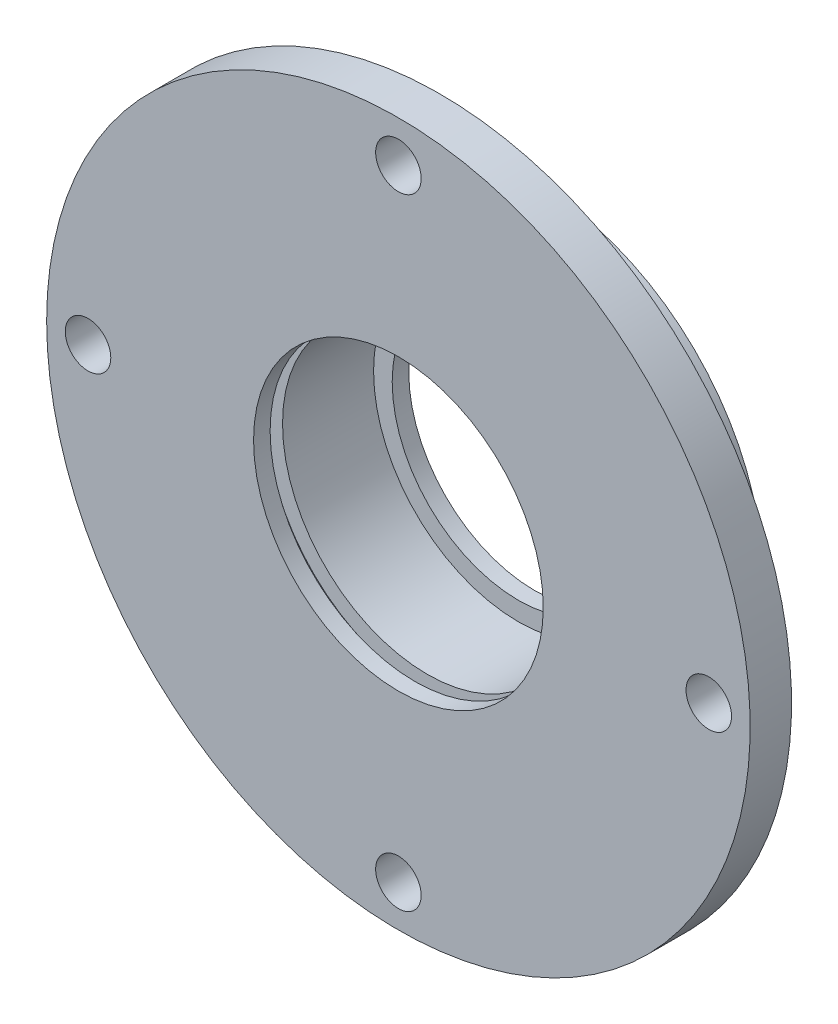
ISO-10303-21;
HEADER;
FILE_DESCRIPTION(('STEP AP214'),'2;1');
FILE_NAME('part.step','',(''),(''),'','','');
FILE_SCHEMA(('AUTOMOTIVE_DESIGN { 1 0 10303 214 1 1 1 1 }'));
ENDSEC;
DATA;
#1=APPLICATION_CONTEXT('core data for automotive mechanical design processes');
#2=APPLICATION_PROTOCOL_DEFINITION('international standard','automotive_design',2000,#1);
#3=PRODUCT_CONTEXT('',#1,'mechanical');
#4=PRODUCT('Part','Part','',(#3));
#5=PRODUCT_RELATED_PRODUCT_CATEGORY('part','',(#4));
#6=PRODUCT_DEFINITION_FORMATION('','',#4);
#7=PRODUCT_DEFINITION_CONTEXT('part definition',#1,'design');
#8=PRODUCT_DEFINITION('design','',#6,#7);
#9=PRODUCT_DEFINITION_SHAPE('','',#8);
#10=(LENGTH_UNIT() NAMED_UNIT(*) SI_UNIT(.MILLI.,.METRE.));
#11=(NAMED_UNIT(*) PLANE_ANGLE_UNIT() SI_UNIT($,.RADIAN.));
#12=(NAMED_UNIT(*) SI_UNIT($,.STERADIAN.) SOLID_ANGLE_UNIT());
#13=UNCERTAINTY_MEASURE_WITH_UNIT(LENGTH_MEASURE(1.E-05),#10,'distance_accuracy_value','');
#14=(GEOMETRIC_REPRESENTATION_CONTEXT(3) GLOBAL_UNCERTAINTY_ASSIGNED_CONTEXT((#13)) GLOBAL_UNIT_ASSIGNED_CONTEXT((#10,
#11,#12)) REPRESENTATION_CONTEXT('',''));
#15=CARTESIAN_POINT('',(0.,0.,0.));
#16=DIRECTION('',(0.,0.,1.));
#17=DIRECTION('',(1.,0.,0.));
#18=AXIS2_PLACEMENT_3D('',#15,#16,#17);
#19=CARTESIAN_POINT('',(0.,0.,-30.5070126984127));
#20=DIRECTION('',(0.,0.,-1.));
#21=DIRECTION('',(-1.,0.,0.));
#22=AXIS2_PLACEMENT_3D('',#19,#20,#21);
#23=CYLINDRICAL_SURFACE('',#22,17.5000000000006);
#24=CARTESIAN_POINT('',(0.,0.,-7.50000000000272));
#25=DIRECTION('',(0.,0.,-1.));
#26=DIRECTION('',(-1.,0.,0.));
#27=AXIS2_PLACEMENT_3D('',#24,#25,#26);
#28=CIRCLE('',#27,17.5000000000245);
#29=CARTESIAN_POINT('',(-17.5000000000245,0.,-7.50000000000272));
#30=VERTEX_POINT('',#29);
#31=EDGE_CURVE('E58',#30,#30,#28,.T.);
#32=ORIENTED_EDGE('',*,*,#31,.T.);
#33=EDGE_LOOP('',(#32));
#34=FACE_BOUND('',#33,.T.);
#35=CARTESIAN_POINT('',(0.,0.,3.50000000000126));
#36=DIRECTION('',(0.,0.,1.));
#37=DIRECTION('',(1.,0.,0.));
#38=AXIS2_PLACEMENT_3D('',#35,#36,#37);
#39=CIRCLE('',#38,17.5000000000006);
#40=CARTESIAN_POINT('',(17.5000000000006,0.,3.50000000000126));
#41=VERTEX_POINT('',#40);
#42=EDGE_CURVE('E33',#41,#41,#39,.F.);
#43=ORIENTED_EDGE('',*,*,#42,.F.);
#44=EDGE_LOOP('',(#43));
#45=FACE_BOUND('',#44,.T.);
#46=ADVANCED_FACE('F30',(#34,#45),#23,.F.);
#47=CARTESIAN_POINT('',(0.,0.,7.000000000005));
#48=DIRECTION('',(0.,0.,-1.));
#49=DIRECTION('',(-1.,0.,0.));
#50=AXIS2_PLACEMENT_3D('',#47,#48,#49);
#51=CIRCLE('',#50,17.4999999999768);
#52=CARTESIAN_POINT('',(-17.4999999999768,0.,7.000000000005));
#53=VERTEX_POINT('',#52);
#54=EDGE_CURVE('E10',#53,#53,#51,.T.);
#55=ORIENTED_EDGE('',*,*,#54,.F.);
#56=EDGE_LOOP('',(#55));
#57=FACE_BOUND('',#56,.T.);
#58=CARTESIAN_POINT('',(0.,0.,4.99999999999773));
#59=DIRECTION('',(0.,0.,-1.));
#60=DIRECTION('',(-1.,0.,0.));
#61=AXIS2_PLACEMENT_3D('',#58,#59,#60);
#62=CIRCLE('',#61,17.5000000000006);
#63=CARTESIAN_POINT('',(-17.5000000000006,0.,4.99999999999773));
#64=VERTEX_POINT('',#63);
#65=EDGE_CURVE('E59',#64,#64,#62,.F.);
#66=ORIENTED_EDGE('',*,*,#65,.F.);
#67=EDGE_LOOP('',(#66));
#68=FACE_BOUND('',#67,.T.);
#69=ADVANCED_FACE('F116',(#57,#68),#23,.F.);
#70=CARTESIAN_POINT('',(17.4999999999768,0.,7.0000000000025));
#71=DIRECTION('',(0.,0.,-1.));
#72=DIRECTION('',(-1.,0.,0.));
#73=AXIS2_PLACEMENT_3D('',#70,#71,#72);
#74=PLANE('',#73);
#75=CARTESIAN_POINT('',(0.,37.4999999999768,7.000000000005));
#76=DIRECTION('',(0.,0.,1.));
#77=DIRECTION('',(1.,0.,0.));
#78=AXIS2_PLACEMENT_3D('',#75,#76,#77);
#79=CIRCLE('',#78,2.75);
#80=CARTESIAN_POINT('',(2.75,37.4999999999768,7.000000000005));
#81=VERTEX_POINT('',#80);
#82=EDGE_CURVE('E50',#81,#81,#79,.T.);
#83=ORIENTED_EDGE('',*,*,#82,.F.);
#84=EDGE_LOOP('',(#83));
#85=FACE_BOUND('',#84,.T.);
#86=CARTESIAN_POINT('',(37.4999999999768,0.,7.000000000005));
#87=DIRECTION('',(0.,0.,1.));
#88=DIRECTION('',(1.,0.,0.));
#89=AXIS2_PLACEMENT_3D('',#86,#87,#88);
#90=CIRCLE('',#89,2.75000000000013);
#91=CARTESIAN_POINT('',(40.2499999999769,0.,7.000000000005));
#92=VERTEX_POINT('',#91);
#93=EDGE_CURVE('E76',#92,#92,#90,.T.);
#94=ORIENTED_EDGE('',*,*,#93,.F.);
#95=EDGE_LOOP('',(#94));
#96=FACE_BOUND('',#95,.T.);
#97=CARTESIAN_POINT('',(0.,-37.4999999999768,7.000000000005));
#98=DIRECTION('',(0.,0.,1.));
#99=DIRECTION('',(1.,0.,0.));
#100=AXIS2_PLACEMENT_3D('',#97,#98,#99);
#101=CIRCLE('',#100,2.75000000000026);
#102=CARTESIAN_POINT('',(2.75000000000026,-37.4999999999768,7.000000000005));
#103=VERTEX_POINT('',#102);
#104=EDGE_CURVE('E79',#103,#103,#101,.T.);
#105=ORIENTED_EDGE('',*,*,#104,.F.);
#106=EDGE_LOOP('',(#105));
#107=FACE_BOUND('',#106,.T.);
#108=CARTESIAN_POINT('',(-37.4999999999768,0.,7.000000000005));
#109=DIRECTION('',(0.,0.,1.));
#110=DIRECTION('',(1.,0.,0.));
#111=AXIS2_PLACEMENT_3D('',#108,#109,#110);
#112=CIRCLE('',#111,2.75000000000039);
#113=CARTESIAN_POINT('',(-34.7499999999764,0.,7.000000000005));
#114=VERTEX_POINT('',#113);
#115=EDGE_CURVE('E65',#114,#114,#112,.T.);
#116=ORIENTED_EDGE('',*,*,#115,.F.);
#117=EDGE_LOOP('',(#116));
#118=FACE_BOUND('',#117,.T.);
#119=CARTESIAN_POINT('',(0.,0.,7.00000000000001));
#120=DIRECTION('',(0.,0.,-1.));
#121=DIRECTION('',(-1.,0.,0.));
#122=AXIS2_PLACEMENT_3D('',#119,#120,#121);
#123=CIRCLE('',#122,42.4999999999768);
#124=CARTESIAN_POINT('',(-42.4999999999768,0.,7.00000000000001));
#125=VERTEX_POINT('',#124);
#126=EDGE_CURVE('E37',#125,#125,#123,.T.);
#127=ORIENTED_EDGE('',*,*,#126,.F.);
#128=EDGE_LOOP('',(#127));
#129=FACE_BOUND('',#128,.T.);
#130=ORIENTED_EDGE('',*,*,#54,.T.);
#131=EDGE_LOOP('',(#130));
#132=FACE_BOUND('',#131,.T.);
#133=ADVANCED_FACE('F111',(#85,#96,#107,#118,#129,#132),#74,.F.);
#134=CARTESIAN_POINT('',(0.,0.,-30.5070126984127));
#135=DIRECTION('',(0.,0.,-1.));
#136=DIRECTION('',(-1.,0.,0.));
#137=AXIS2_PLACEMENT_3D('',#134,#135,#136);
#138=CYLINDRICAL_SURFACE('',#137,42.4999999999768);
#139=CARTESIAN_POINT('',(0.,0.,2.00000000000001));
#140=DIRECTION('',(0.,0.,-1.));
#141=DIRECTION('',(-1.,0.,0.));
#142=AXIS2_PLACEMENT_3D('',#139,#140,#141);
#143=CIRCLE('',#142,42.4999999999768);
#144=CARTESIAN_POINT('',(-42.4999999999768,0.,2.00000000000001));
#145=VERTEX_POINT('',#144);
#146=EDGE_CURVE('E42',#145,#145,#143,.T.);
#147=ORIENTED_EDGE('',*,*,#146,.F.);
#148=EDGE_LOOP('',(#147));
#149=FACE_BOUND('',#148,.T.);
#150=ORIENTED_EDGE('',*,*,#126,.T.);
#151=EDGE_LOOP('',(#150));
#152=FACE_BOUND('',#151,.T.);
#153=ADVANCED_FACE('F108',(#149,#152),#138,.T.);
#154=CARTESIAN_POINT('',(42.4999999999768,0.,2.));
#155=DIRECTION('',(0.,0.,1.));
#156=DIRECTION('',(1.,0.,0.));
#157=AXIS2_PLACEMENT_3D('',#154,#155,#156);
#158=PLANE('',#157);
#159=CARTESIAN_POINT('',(0.,37.4999999999768,2.));
#160=DIRECTION('',(0.,0.,1.));
#161=DIRECTION('',(1.,0.,0.));
#162=AXIS2_PLACEMENT_3D('',#159,#160,#161);
#163=CIRCLE('',#162,2.75);
#164=CARTESIAN_POINT('',(2.75,37.4999999999768,2.));
#165=VERTEX_POINT('',#164);
#166=EDGE_CURVE('E56',#165,#165,#163,.F.);
#167=ORIENTED_EDGE('',*,*,#166,.F.);
#168=EDGE_LOOP('',(#167));
#169=FACE_BOUND('',#168,.T.);
#170=CARTESIAN_POINT('',(37.4999999999768,0.,2.));
#171=DIRECTION('',(0.,0.,1.));
#172=DIRECTION('',(1.,0.,0.));
#173=AXIS2_PLACEMENT_3D('',#170,#171,#172);
#174=CIRCLE('',#173,2.75000000000013);
#175=CARTESIAN_POINT('',(40.2499999999769,0.,2.));
#176=VERTEX_POINT('',#175);
#177=EDGE_CURVE('E53',#176,#176,#174,.F.);
#178=ORIENTED_EDGE('',*,*,#177,.F.);
#179=EDGE_LOOP('',(#178));
#180=FACE_BOUND('',#179,.T.);
#181=CARTESIAN_POINT('',(0.,-37.4999999999768,2.));
#182=DIRECTION('',(0.,0.,1.));
#183=DIRECTION('',(1.,0.,0.));
#184=AXIS2_PLACEMENT_3D('',#181,#182,#183);
#185=CIRCLE('',#184,2.75000000000026);
#186=CARTESIAN_POINT('',(2.75000000000026,-37.4999999999768,2.));
#187=VERTEX_POINT('',#186);
#188=EDGE_CURVE('E49',#187,#187,#185,.F.);
#189=ORIENTED_EDGE('',*,*,#188,.F.);
#190=EDGE_LOOP('',(#189));
#191=FACE_BOUND('',#190,.T.);
#192=CARTESIAN_POINT('',(-37.4999999999768,0.,2.00000000000001));
#193=DIRECTION('',(0.,0.,1.));
#194=DIRECTION('',(1.,0.,0.));
#195=AXIS2_PLACEMENT_3D('',#192,#193,#194);
#196=CIRCLE('',#195,2.75000000000039);
#197=CARTESIAN_POINT('',(-34.7499999999764,0.,2.00000000000001));
#198=VERTEX_POINT('',#197);
#199=EDGE_CURVE('E46',#198,#198,#196,.F.);
#200=ORIENTED_EDGE('',*,*,#199,.F.);
#201=EDGE_LOOP('',(#200));
#202=FACE_BOUND('',#201,.T.);
#203=CARTESIAN_POINT('',(0.,0.,2.));
#204=DIRECTION('',(0.,0.,-1.));
#205=DIRECTION('',(-1.,0.,0.));
#206=AXIS2_PLACEMENT_3D('',#203,#204,#205);
#207=CIRCLE('',#206,22.5000000000013);
#208=CARTESIAN_POINT('',(-22.5000000000012,0.,2.));
#209=VERTEX_POINT('',#208);
#210=EDGE_CURVE('E101',#209,#209,#207,.T.);
#211=ORIENTED_EDGE('',*,*,#210,.F.);
#212=EDGE_LOOP('',(#211));
#213=FACE_BOUND('',#212,.T.);
#214=ORIENTED_EDGE('',*,*,#146,.T.);
#215=EDGE_LOOP('',(#214));
#216=FACE_BOUND('',#215,.T.);
#217=ADVANCED_FACE('F106',(#169,#180,#191,#202,#213,#216),#158,.F.);
#218=CARTESIAN_POINT('',(0.,0.,-30.5070126984127));
#219=DIRECTION('',(0.,0.,-1.));
#220=DIRECTION('',(-1.,0.,0.));
#221=AXIS2_PLACEMENT_3D('',#218,#219,#220);
#222=CYLINDRICAL_SURFACE('',#221,22.5000000000013);
#223=CARTESIAN_POINT('',(0.,0.,-2.));
#224=DIRECTION('',(0.,0.,-1.));
#225=DIRECTION('',(-1.,0.,0.));
#226=AXIS2_PLACEMENT_3D('',#223,#224,#225);
#227=CIRCLE('',#226,22.5000000000013);
#228=CARTESIAN_POINT('',(-22.5000000000012,0.,-2.));
#229=VERTEX_POINT('',#228);
#230=EDGE_CURVE('E98',#229,#229,#227,.T.);
#231=ORIENTED_EDGE('',*,*,#230,.F.);
#232=EDGE_LOOP('',(#231));
#233=FACE_BOUND('',#232,.T.);
#234=ORIENTED_EDGE('',*,*,#210,.T.);
#235=EDGE_LOOP('',(#234));
#236=FACE_BOUND('',#235,.T.);
#237=ADVANCED_FACE('F180',(#233,#236),#222,.T.);
#238=CARTESIAN_POINT('',(22.5000000000013,0.,-2.));
#239=DIRECTION('',(0.,0.,-1.));
#240=DIRECTION('',(-1.,0.,0.));
#241=AXIS2_PLACEMENT_3D('',#238,#239,#240);
#242=PLANE('',#241);
#243=CARTESIAN_POINT('',(0.,0.,-2.));
#244=DIRECTION('',(0.,0.,-1.));
#245=DIRECTION('',(-1.,0.,0.));
#246=AXIS2_PLACEMENT_3D('',#243,#244,#245);
#247=CIRCLE('',#246,27.4999999999768);
#248=CARTESIAN_POINT('',(-27.4999999999768,0.,-2.));
#249=VERTEX_POINT('',#248);
#250=EDGE_CURVE('E95',#249,#249,#247,.T.);
#251=ORIENTED_EDGE('',*,*,#250,.F.);
#252=EDGE_LOOP('',(#251));
#253=FACE_BOUND('',#252,.T.);
#254=ORIENTED_EDGE('',*,*,#230,.T.);
#255=EDGE_LOOP('',(#254));
#256=FACE_BOUND('',#255,.T.);
#257=ADVANCED_FACE('F176',(#253,#256),#242,.F.);
#258=CARTESIAN_POINT('',(0.,0.,-30.5070126984127));
#259=DIRECTION('',(0.,0.,-1.));
#260=DIRECTION('',(-1.,0.,0.));
#261=AXIS2_PLACEMENT_3D('',#258,#259,#260);
#262=CYLINDRICAL_SURFACE('',#261,27.5000000000006);
#263=CARTESIAN_POINT('',(0.,0.,-9.5));
#264=DIRECTION('',(0.,0.,-1.));
#265=DIRECTION('',(-1.,0.,0.));
#266=AXIS2_PLACEMENT_3D('',#263,#264,#265);
#267=CIRCLE('',#266,27.5000000000245);
#268=CARTESIAN_POINT('',(-27.5000000000245,0.,-9.49999999999999));
#269=VERTEX_POINT('',#268);
#270=EDGE_CURVE('E92',#269,#269,#267,.T.);
#271=ORIENTED_EDGE('',*,*,#270,.F.);
#272=EDGE_LOOP('',(#271));
#273=FACE_BOUND('',#272,.T.);
#274=ORIENTED_EDGE('',*,*,#250,.T.);
#275=EDGE_LOOP('',(#274));
#276=FACE_BOUND('',#275,.T.);
#277=ADVANCED_FACE('F172',(#273,#276),#262,.T.);
#278=CARTESIAN_POINT('',(27.5000000000245,0.,-9.50000000000136));
#279=DIRECTION('',(0.,0.,1.));
#280=DIRECTION('',(1.,0.,0.));
#281=AXIS2_PLACEMENT_3D('',#278,#279,#280);
#282=PLANE('',#281);
#283=CARTESIAN_POINT('',(0.,0.,-9.50000000000272));
#284=DIRECTION('',(0.,0.,-1.));
#285=DIRECTION('',(-1.,0.,0.));
#286=AXIS2_PLACEMENT_3D('',#283,#284,#285);
#287=CIRCLE('',#286,15.2500000000245);
#288=CARTESIAN_POINT('',(-15.2500000000245,0.,-9.50000000000272));
#289=VERTEX_POINT('',#288);
#290=EDGE_CURVE('E89',#289,#289,#287,.T.);
#291=ORIENTED_EDGE('',*,*,#290,.F.);
#292=EDGE_LOOP('',(#291));
#293=FACE_BOUND('',#292,.T.);
#294=ORIENTED_EDGE('',*,*,#270,.T.);
#295=EDGE_LOOP('',(#294));
#296=FACE_BOUND('',#295,.T.);
#297=ADVANCED_FACE('F168',(#293,#296),#282,.F.);
#298=CARTESIAN_POINT('',(0.,0.,-30.5070126984127));
#299=DIRECTION('',(0.,0.,-1.));
#300=DIRECTION('',(-1.,0.,0.));
#301=AXIS2_PLACEMENT_3D('',#298,#299,#300);
#302=CYLINDRICAL_SURFACE('',#301,15.2500000000245);
#303=CARTESIAN_POINT('',(0.,0.,-7.50000000000272));
#304=DIRECTION('',(0.,0.,-1.));
#305=DIRECTION('',(-1.,0.,0.));
#306=AXIS2_PLACEMENT_3D('',#303,#304,#305);
#307=CIRCLE('',#306,15.2500000000245);
#308=CARTESIAN_POINT('',(-15.2500000000245,0.,-7.50000000000272));
#309=VERTEX_POINT('',#308);
#310=EDGE_CURVE('E86',#309,#309,#307,.T.);
#311=ORIENTED_EDGE('',*,*,#310,.F.);
#312=EDGE_LOOP('',(#311));
#313=FACE_BOUND('',#312,.T.);
#314=ORIENTED_EDGE('',*,*,#290,.T.);
#315=EDGE_LOOP('',(#314));
#316=FACE_BOUND('',#315,.T.);
#317=ADVANCED_FACE('F164',(#313,#316),#302,.F.);
#318=CARTESIAN_POINT('',(15.2500000000245,0.,-7.50000000000273));
#319=DIRECTION('',(0.,0.,-1.));
#320=DIRECTION('',(-1.,0.,0.));
#321=AXIS2_PLACEMENT_3D('',#318,#319,#320);
#322=PLANE('',#321);
#323=ORIENTED_EDGE('',*,*,#31,.F.);
#324=EDGE_LOOP('',(#323));
#325=FACE_BOUND('',#324,.T.);
#326=ORIENTED_EDGE('',*,*,#310,.T.);
#327=EDGE_LOOP('',(#326));
#328=FACE_BOUND('',#327,.T.);
#329=ADVANCED_FACE('F160',(#325,#328),#322,.F.);
#330=CARTESIAN_POINT('',(-37.4999999999768,0.,7.000000000005));
#331=DIRECTION('',(0.,0.,-1.));
#332=DIRECTION('',(-1.,0.,0.));
#333=AXIS2_PLACEMENT_3D('',#330,#331,#332);
#334=CYLINDRICAL_SURFACE('',#333,2.75000000000039);
#335=ORIENTED_EDGE('',*,*,#115,.T.);
#336=EDGE_LOOP('',(#335));
#337=FACE_BOUND('',#336,.T.);
#338=ORIENTED_EDGE('',*,*,#199,.T.);
#339=EDGE_LOOP('',(#338));
#340=FACE_BOUND('',#339,.T.);
#341=ADVANCED_FACE('F156',(#337,#340),#334,.F.);
#342=CARTESIAN_POINT('',(0.,-37.4999999999768,7.000000000005));
#343=DIRECTION('',(0.,0.,-1.));
#344=DIRECTION('',(-1.,0.,0.));
#345=AXIS2_PLACEMENT_3D('',#342,#343,#344);
#346=CYLINDRICAL_SURFACE('',#345,2.75000000000026);
#347=ORIENTED_EDGE('',*,*,#104,.T.);
#348=EDGE_LOOP('',(#347));
#349=FACE_BOUND('',#348,.T.);
#350=ORIENTED_EDGE('',*,*,#188,.T.);
#351=EDGE_LOOP('',(#350));
#352=FACE_BOUND('',#351,.T.);
#353=ADVANCED_FACE('F152',(#349,#352),#346,.F.);
#354=CARTESIAN_POINT('',(37.4999999999768,0.,7.000000000005));
#355=DIRECTION('',(0.,0.,-1.));
#356=DIRECTION('',(-1.,0.,0.));
#357=AXIS2_PLACEMENT_3D('',#354,#355,#356);
#358=CYLINDRICAL_SURFACE('',#357,2.75000000000013);
#359=ORIENTED_EDGE('',*,*,#93,.T.);
#360=EDGE_LOOP('',(#359));
#361=FACE_BOUND('',#360,.T.);
#362=ORIENTED_EDGE('',*,*,#177,.T.);
#363=EDGE_LOOP('',(#362));
#364=FACE_BOUND('',#363,.T.);
#365=ADVANCED_FACE('F145',(#361,#364),#358,.F.);
#366=CARTESIAN_POINT('',(0.,37.4999999999768,7.000000000005));
#367=DIRECTION('',(0.,0.,-1.));
#368=DIRECTION('',(-1.,0.,0.));
#369=AXIS2_PLACEMENT_3D('',#366,#367,#368);
#370=CYLINDRICAL_SURFACE('',#369,2.75);
#371=ORIENTED_EDGE('',*,*,#82,.T.);
#372=EDGE_LOOP('',(#371));
#373=FACE_BOUND('',#372,.T.);
#374=ORIENTED_EDGE('',*,*,#166,.T.);
#375=EDGE_LOOP('',(#374));
#376=FACE_BOUND('',#375,.T.);
#377=ADVANCED_FACE('F135',(#373,#376),#370,.F.);
#378=CARTESIAN_POINT('',(-2.32332926463297E-11,0.,3.50000000000126));
#379=DIRECTION('',(0.,0.,1.));
#380=DIRECTION('',(1.,0.,0.));
#381=AXIS2_PLACEMENT_3D('',#378,#379,#380);
#382=PLANE('',#381);
#383=CARTESIAN_POINT('',(0.,0.,3.50000000000001));
#384=DIRECTION('',(0.,0.,-1.));
#385=DIRECTION('',(-1.,0.,0.));
#386=AXIS2_PLACEMENT_3D('',#383,#384,#385);
#387=CIRCLE('',#386,19.4999999999768);
#388=CARTESIAN_POINT('',(-19.4999999999768,0.,3.50000000000001));
#389=VERTEX_POINT('',#388);
#390=EDGE_CURVE('E61',#389,#389,#387,.T.);
#391=ORIENTED_EDGE('',*,*,#390,.F.);
#392=EDGE_LOOP('',(#391));
#393=FACE_BOUND('',#392,.T.);
#394=ORIENTED_EDGE('',*,*,#42,.T.);
#395=EDGE_LOOP('',(#394));
#396=FACE_BOUND('',#395,.T.);
#397=ADVANCED_FACE('F132',(#393,#396),#382,.T.);
#398=CARTESIAN_POINT('',(19.4999999999768,0.,4.99999999999773));
#399=DIRECTION('',(0.,0.,-1.));
#400=DIRECTION('',(-1.,0.,0.));
#401=AXIS2_PLACEMENT_3D('',#398,#399,#400);
#402=PLANE('',#401);
#403=CARTESIAN_POINT('',(0.,0.,5.00000000000001));
#404=DIRECTION('',(0.,0.,-1.));
#405=DIRECTION('',(-1.,0.,0.));
#406=AXIS2_PLACEMENT_3D('',#403,#404,#405);
#407=CIRCLE('',#406,19.4999999999768);
#408=CARTESIAN_POINT('',(-19.4999999999768,0.,5.00000000000001));
#409=VERTEX_POINT('',#408);
#410=EDGE_CURVE('E67',#409,#409,#407,.T.);
#411=ORIENTED_EDGE('',*,*,#410,.T.);
#412=EDGE_LOOP('',(#411));
#413=FACE_BOUND('',#412,.T.);
#414=ORIENTED_EDGE('',*,*,#65,.T.);
#415=EDGE_LOOP('',(#414));
#416=FACE_BOUND('',#415,.T.);
#417=ADVANCED_FACE('F134',(#413,#416),#402,.T.);
#418=CARTESIAN_POINT('',(0.,0.,-30.5070126984127));
#419=DIRECTION('',(0.,0.,-1.));
#420=DIRECTION('',(-1.,0.,0.));
#421=AXIS2_PLACEMENT_3D('',#418,#419,#420);
#422=CYLINDRICAL_SURFACE('',#421,19.4999999999768);
#423=ORIENTED_EDGE('',*,*,#390,.T.);
#424=EDGE_LOOP('',(#423));
#425=FACE_BOUND('',#424,.T.);
#426=ORIENTED_EDGE('',*,*,#410,.F.);
#427=EDGE_LOOP('',(#426));
#428=FACE_BOUND('',#427,.T.);
#429=ADVANCED_FACE('F142',(#425,#428),#422,.F.);
#430=CLOSED_SHELL('',(#46,#69,#133,#153,#217,#237,#257,#277,#297,#317,#329,#341,#353,#365,#377,
#397,#417,#429));
#431=MANIFOLD_SOLID_BREP('B2',#430);
#432=ADVANCED_BREP_SHAPE_REPRESENTATION('',(#18,#431),#14);
#433=SHAPE_DEFINITION_REPRESENTATION(#9,#432);
ENDSEC;
END-ISO-10303-21;
